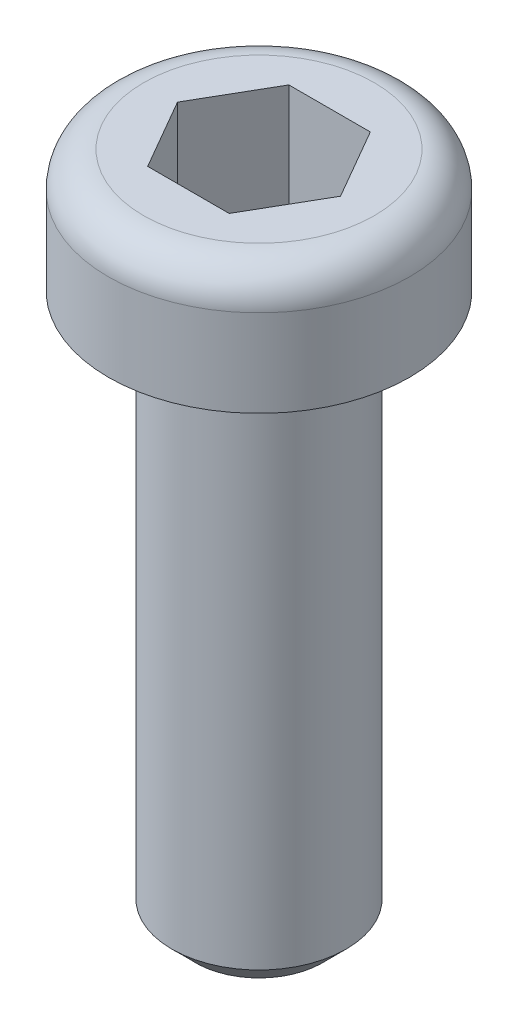
ISO-10303-21;
HEADER;
FILE_DESCRIPTION(('STEP AP214'),'2;1');
FILE_NAME('part.step','',(''),(''),'','','');
FILE_SCHEMA(('AUTOMOTIVE_DESIGN { 1 0 10303 214 1 1 1 1 }'));
ENDSEC;
DATA;
#1=APPLICATION_CONTEXT('core data for automotive mechanical design processes');
#2=APPLICATION_PROTOCOL_DEFINITION('international standard','automotive_design',2000,#1);
#3=PRODUCT_CONTEXT('',#1,'mechanical');
#4=PRODUCT('Part','Part','',(#3));
#5=PRODUCT_RELATED_PRODUCT_CATEGORY('part','',(#4));
#6=PRODUCT_DEFINITION_FORMATION('','',#4);
#7=PRODUCT_DEFINITION_CONTEXT('part definition',#1,'design');
#8=PRODUCT_DEFINITION('design','',#6,#7);
#9=PRODUCT_DEFINITION_SHAPE('','',#8);
#10=(LENGTH_UNIT() NAMED_UNIT(*) SI_UNIT(.MILLI.,.METRE.));
#11=(NAMED_UNIT(*) PLANE_ANGLE_UNIT() SI_UNIT($,.RADIAN.));
#12=(NAMED_UNIT(*) SI_UNIT($,.STERADIAN.) SOLID_ANGLE_UNIT());
#13=UNCERTAINTY_MEASURE_WITH_UNIT(LENGTH_MEASURE(1.E-05),#10,'distance_accuracy_value','');
#14=(GEOMETRIC_REPRESENTATION_CONTEXT(3) GLOBAL_UNCERTAINTY_ASSIGNED_CONTEXT((#13)) GLOBAL_UNIT_ASSIGNED_CONTEXT((#10,
#11,#12)) REPRESENTATION_CONTEXT('',''));
#15=CARTESIAN_POINT('',(0.,0.,0.));
#16=DIRECTION('',(0.,0.,1.));
#17=DIRECTION('',(1.,0.,0.));
#18=AXIS2_PLACEMENT_3D('',#15,#16,#17);
#19=CARTESIAN_POINT('',(0.,2.6,0.));
#20=DIRECTION('',(0.,1.,0.));
#21=DIRECTION('',(0.,0.,1.));
#22=AXIS2_PLACEMENT_3D('',#19,#20,#21);
#23=PLANE('',#22);
#24=CARTESIAN_POINT('',(0.,2.6,0.));
#25=DIRECTION('',(0.,1.,0.));
#26=DIRECTION('',(0.,0.,1.));
#27=AXIS2_PLACEMENT_3D('',#24,#25,#26);
#28=CIRCLE('',#27,2.45);
#29=CARTESIAN_POINT('',(0.,2.6,2.45));
#30=VERTEX_POINT('',#29);
#31=EDGE_CURVE('E144',#30,#30,#28,.T.);
#32=ORIENTED_EDGE('',*,*,#31,.T.);
#33=EDGE_LOOP('',(#32));
#34=FACE_BOUND('',#33,.T.);
#35=DIRECTION('',(-0.5,0.,-0.866025403784438));
#36=VECTOR('',#35,1.);
#37=CARTESIAN_POINT('',(1.73205080756888,2.6,0.));
#38=LINE('',#37,#36);
#39=CARTESIAN_POINT('',(1.73205080756888,2.6,0.));
#40=VERTEX_POINT('',#39);
#41=CARTESIAN_POINT('',(0.866025403784438,2.6,-1.5));
#42=VERTEX_POINT('',#41);
#43=EDGE_CURVE('E102',#40,#42,#38,.T.);
#44=ORIENTED_EDGE('',*,*,#43,.F.);
#45=DIRECTION('',(0.5,0.,-0.866025403784439));
#46=VECTOR('',#45,1.);
#47=CARTESIAN_POINT('',(0.86602540378444,2.6,1.5));
#48=LINE('',#47,#46);
#49=CARTESIAN_POINT('',(0.86602540378444,2.6,1.5));
#50=VERTEX_POINT('',#49);
#51=EDGE_CURVE('E82',#50,#40,#48,.T.);
#52=ORIENTED_EDGE('',*,*,#51,.F.);
#53=DIRECTION('',(1.,0.,0.));
#54=VECTOR('',#53,1.);
#55=CARTESIAN_POINT('',(-0.866025403784438,2.6,1.5));
#56=LINE('',#55,#54);
#57=CARTESIAN_POINT('',(-0.866025403784438,2.6,1.5));
#58=VERTEX_POINT('',#57);
#59=EDGE_CURVE('E53',#58,#50,#56,.T.);
#60=ORIENTED_EDGE('',*,*,#59,.F.);
#61=DIRECTION('',(0.5,0.,0.866025403784438));
#62=VECTOR('',#61,1.);
#63=CARTESIAN_POINT('',(-1.73205080756888,2.6,0.));
#64=LINE('',#63,#62);
#65=CARTESIAN_POINT('',(-1.73205080756888,2.6,0.));
#66=VERTEX_POINT('',#65);
#67=EDGE_CURVE('E113',#66,#58,#64,.T.);
#68=ORIENTED_EDGE('',*,*,#67,.F.);
#69=DIRECTION('',(-0.5,0.,0.866025403784438));
#70=VECTOR('',#69,1.);
#71=CARTESIAN_POINT('',(-0.866025403784438,2.6,-1.5));
#72=LINE('',#71,#70);
#73=CARTESIAN_POINT('',(-0.866025403784438,2.6,-1.5));
#74=VERTEX_POINT('',#73);
#75=EDGE_CURVE('E101',#74,#66,#72,.T.);
#76=ORIENTED_EDGE('',*,*,#75,.F.);
#77=DIRECTION('',(-1.,0.,0.));
#78=VECTOR('',#77,1.);
#79=CARTESIAN_POINT('',(0.866025403784438,2.6,-1.5));
#80=LINE('',#79,#78);
#81=EDGE_CURVE('E91',#42,#74,#80,.T.);
#82=ORIENTED_EDGE('',*,*,#81,.F.);
#83=EDGE_LOOP('',(#44,#52,#60,#68,#76,#82));
#84=FACE_BOUND('',#83,.T.);
#85=ADVANCED_FACE('F32',(#34,#84),#23,.T.);
#86=CARTESIAN_POINT('',(0.,0.,0.));
#87=DIRECTION('',(0.,1.,0.));
#88=DIRECTION('',(0.,0.,1.));
#89=AXIS2_PLACEMENT_3D('',#86,#87,#88);
#90=PLANE('',#89);
#91=CARTESIAN_POINT('',(0.,0.,0.));
#92=DIRECTION('',(0.,1.,0.));
#93=DIRECTION('',(0.,0.,1.));
#94=AXIS2_PLACEMENT_3D('',#91,#92,#93);
#95=CIRCLE('',#94,1.85);
#96=CARTESIAN_POINT('',(0.,0.,1.85));
#97=VERTEX_POINT('',#96);
#98=EDGE_CURVE('E150',#97,#97,#95,.F.);
#99=ORIENTED_EDGE('',*,*,#98,.F.);
#100=EDGE_LOOP('',(#99));
#101=FACE_BOUND('',#100,.T.);
#102=CARTESIAN_POINT('',(0.,0.,0.));
#103=DIRECTION('',(0.,1.,0.));
#104=DIRECTION('',(0.,0.,1.));
#105=AXIS2_PLACEMENT_3D('',#102,#103,#104);
#106=CIRCLE('',#105,3.2);
#107=CARTESIAN_POINT('',(0.,0.,3.2));
#108=VERTEX_POINT('',#107);
#109=EDGE_CURVE('E141',#108,#108,#106,.T.);
#110=ORIENTED_EDGE('',*,*,#109,.F.);
#111=EDGE_LOOP('',(#110));
#112=FACE_BOUND('',#111,.T.);
#113=ADVANCED_FACE('F166',(#101,#112),#90,.F.);
#114=CARTESIAN_POINT('',(0.,2.6,0.));
#115=DIRECTION('',(0.,-1.,0.));
#116=DIRECTION('',(0.,0.,-1.));
#117=AXIS2_PLACEMENT_3D('',#114,#115,#116);
#118=CYLINDRICAL_SURFACE('',#117,3.2);
#119=CARTESIAN_POINT('',(0.,1.85,0.));
#120=DIRECTION('',(0.,1.,0.));
#121=DIRECTION('',(0.,0.,1.));
#122=AXIS2_PLACEMENT_3D('',#119,#120,#121);
#123=CIRCLE('',#122,3.2);
#124=CARTESIAN_POINT('',(0.,1.85,3.2));
#125=VERTEX_POINT('',#124);
#126=EDGE_CURVE('E147',#125,#125,#123,.F.);
#127=ORIENTED_EDGE('',*,*,#126,.T.);
#128=EDGE_LOOP('',(#127));
#129=FACE_BOUND('',#128,.T.);
#130=ORIENTED_EDGE('',*,*,#109,.T.);
#131=EDGE_LOOP('',(#130));
#132=FACE_BOUND('',#131,.T.);
#133=ADVANCED_FACE('F172',(#129,#132),#118,.T.);
#134=CARTESIAN_POINT('',(0.86602540378444,2.6,1.5));
#135=DIRECTION('',(-0.866025403784439,0.,-0.5));
#136=DIRECTION('',(-0.5,0.,0.866025403784439));
#137=AXIS2_PLACEMENT_3D('',#134,#135,#136);
#138=PLANE('',#137);
#139=DIRECTION('',(0.5,0.,-0.866025403784439));
#140=VECTOR('',#139,1.);
#141=CARTESIAN_POINT('',(0.86602540378444,0.,1.5));
#142=LINE('',#141,#140);
#143=CARTESIAN_POINT('',(0.86602540378444,0.,1.5));
#144=VERTEX_POINT('',#143);
#145=CARTESIAN_POINT('',(1.73205080756888,0.,0.));
#146=VERTEX_POINT('',#145);
#147=EDGE_CURVE('E120',#144,#146,#142,.T.);
#148=ORIENTED_EDGE('',*,*,#147,.F.);
#149=DIRECTION('',(0.,-1.,0.));
#150=VECTOR('',#149,1.);
#151=CARTESIAN_POINT('',(0.86602540378444,2.6,1.5));
#152=LINE('',#151,#150);
#153=EDGE_CURVE('E119',#50,#144,#152,.T.);
#154=ORIENTED_EDGE('',*,*,#153,.F.);
#155=ORIENTED_EDGE('',*,*,#51,.T.);
#156=DIRECTION('',(0.,-1.,0.));
#157=VECTOR('',#156,1.);
#158=CARTESIAN_POINT('',(1.73205080756888,2.6,0.));
#159=LINE('',#158,#157);
#160=EDGE_CURVE('E139',#40,#146,#159,.T.);
#161=ORIENTED_EDGE('',*,*,#160,.T.);
#162=EDGE_LOOP('',(#148,#154,#155,#161));
#163=FACE_BOUND('',#162,.T.);
#164=ADVANCED_FACE('F176',(#163),#138,.T.);
#165=CARTESIAN_POINT('',(1.73205080756888,2.6,0.));
#166=DIRECTION('',(-0.866025403784438,0.,0.5));
#167=DIRECTION('',(0.5,0.,0.866025403784438));
#168=AXIS2_PLACEMENT_3D('',#165,#166,#167);
#169=PLANE('',#168);
#170=DIRECTION('',(-0.5,0.,-0.866025403784438));
#171=VECTOR('',#170,1.);
#172=CARTESIAN_POINT('',(1.73205080756888,0.,0.));
#173=LINE('',#172,#171);
#174=CARTESIAN_POINT('',(0.866025403784438,0.,-1.5));
#175=VERTEX_POINT('',#174);
#176=EDGE_CURVE('E123',#146,#175,#173,.T.);
#177=ORIENTED_EDGE('',*,*,#176,.F.);
#178=ORIENTED_EDGE('',*,*,#160,.F.);
#179=ORIENTED_EDGE('',*,*,#43,.T.);
#180=DIRECTION('',(0.,-1.,0.));
#181=VECTOR('',#180,1.);
#182=CARTESIAN_POINT('',(0.866025403784438,2.6,-1.5));
#183=LINE('',#182,#181);
#184=EDGE_CURVE('E97',#42,#175,#183,.T.);
#185=ORIENTED_EDGE('',*,*,#184,.T.);
#186=EDGE_LOOP('',(#177,#178,#179,#185));
#187=FACE_BOUND('',#186,.T.);
#188=ADVANCED_FACE('F209',(#187),#169,.T.);
#189=CARTESIAN_POINT('',(0.866025403784438,2.6,-1.5));
#190=DIRECTION('',(0.,0.,1.));
#191=DIRECTION('',(1.,0.,0.));
#192=AXIS2_PLACEMENT_3D('',#189,#190,#191);
#193=PLANE('',#192);
#194=DIRECTION('',(-1.,0.,0.));
#195=VECTOR('',#194,1.);
#196=CARTESIAN_POINT('',(0.866025403784438,0.,-1.5));
#197=LINE('',#196,#195);
#198=CARTESIAN_POINT('',(-0.866025403784438,0.,-1.5));
#199=VERTEX_POINT('',#198);
#200=EDGE_CURVE('E126',#175,#199,#197,.T.);
#201=ORIENTED_EDGE('',*,*,#200,.F.);
#202=ORIENTED_EDGE('',*,*,#184,.F.);
#203=ORIENTED_EDGE('',*,*,#81,.T.);
#204=DIRECTION('',(0.,-1.,0.));
#205=VECTOR('',#204,1.);
#206=CARTESIAN_POINT('',(-0.866025403784438,2.6,-1.5));
#207=LINE('',#206,#205);
#208=EDGE_CURVE('E95',#74,#199,#207,.T.);
#209=ORIENTED_EDGE('',*,*,#208,.T.);
#210=EDGE_LOOP('',(#201,#202,#203,#209));
#211=FACE_BOUND('',#210,.T.);
#212=ADVANCED_FACE('F94',(#211),#193,.T.);
#213=CARTESIAN_POINT('',(-0.866025403784438,2.6,-1.5));
#214=DIRECTION('',(0.866025403784439,0.,0.5));
#215=DIRECTION('',(0.5,0.,-0.866025403784439));
#216=AXIS2_PLACEMENT_3D('',#213,#214,#215);
#217=PLANE('',#216);
#218=DIRECTION('',(-0.5,0.,0.866025403784438));
#219=VECTOR('',#218,1.);
#220=CARTESIAN_POINT('',(-0.866025403784438,0.,-1.5));
#221=LINE('',#220,#219);
#222=CARTESIAN_POINT('',(-1.73205080756888,0.,0.));
#223=VERTEX_POINT('',#222);
#224=EDGE_CURVE('E108',#199,#223,#221,.T.);
#225=ORIENTED_EDGE('',*,*,#224,.F.);
#226=ORIENTED_EDGE('',*,*,#208,.F.);
#227=ORIENTED_EDGE('',*,*,#75,.T.);
#228=DIRECTION('',(0.,-1.,0.));
#229=VECTOR('',#228,1.);
#230=CARTESIAN_POINT('',(-1.73205080756888,2.6,0.));
#231=LINE('',#230,#229);
#232=EDGE_CURVE('E110',#66,#223,#231,.T.);
#233=ORIENTED_EDGE('',*,*,#232,.T.);
#234=EDGE_LOOP('',(#225,#226,#227,#233));
#235=FACE_BOUND('',#234,.T.);
#236=ADVANCED_FACE('F105',(#235),#217,.T.);
#237=CARTESIAN_POINT('',(-1.73205080756888,2.6,0.));
#238=DIRECTION('',(0.866025403784438,0.,-0.5));
#239=DIRECTION('',(-0.5,0.,-0.866025403784438));
#240=AXIS2_PLACEMENT_3D('',#237,#238,#239);
#241=PLANE('',#240);
#242=DIRECTION('',(0.5,0.,0.866025403784438));
#243=VECTOR('',#242,1.);
#244=CARTESIAN_POINT('',(-1.73205080756888,0.,0.));
#245=LINE('',#244,#243);
#246=CARTESIAN_POINT('',(-0.866025403784438,0.,1.5));
#247=VERTEX_POINT('',#246);
#248=EDGE_CURVE('E129',#223,#247,#245,.T.);
#249=ORIENTED_EDGE('',*,*,#248,.F.);
#250=ORIENTED_EDGE('',*,*,#232,.F.);
#251=ORIENTED_EDGE('',*,*,#67,.T.);
#252=DIRECTION('',(0.,-1.,0.));
#253=VECTOR('',#252,1.);
#254=CARTESIAN_POINT('',(-0.866025403784438,2.6,1.5));
#255=LINE('',#254,#253);
#256=EDGE_CURVE('E47',#58,#247,#255,.T.);
#257=ORIENTED_EDGE('',*,*,#256,.T.);
#258=EDGE_LOOP('',(#249,#250,#251,#257));
#259=FACE_BOUND('',#258,.T.);
#260=ADVANCED_FACE('F192',(#259),#241,.T.);
#261=CARTESIAN_POINT('',(-0.866025403784438,2.6,1.5));
#262=DIRECTION('',(0.,0.,-1.));
#263=DIRECTION('',(-1.,0.,0.));
#264=AXIS2_PLACEMENT_3D('',#261,#262,#263);
#265=PLANE('',#264);
#266=DIRECTION('',(1.,0.,0.));
#267=VECTOR('',#266,1.);
#268=CARTESIAN_POINT('',(-0.866025403784438,0.,1.5));
#269=LINE('',#268,#267);
#270=EDGE_CURVE('E132',#247,#144,#269,.T.);
#271=ORIENTED_EDGE('',*,*,#270,.F.);
#272=ORIENTED_EDGE('',*,*,#256,.F.);
#273=ORIENTED_EDGE('',*,*,#59,.T.);
#274=ORIENTED_EDGE('',*,*,#153,.T.);
#275=EDGE_LOOP('',(#271,#272,#273,#274));
#276=FACE_BOUND('',#275,.T.);
#277=ADVANCED_FACE('F184',(#276),#265,.T.);
#278=CARTESIAN_POINT('',(0.,1.85,0.));
#279=DIRECTION('',(0.,1.,0.));
#280=DIRECTION('',(0.,0.,1.));
#281=AXIS2_PLACEMENT_3D('',#278,#279,#280);
#282=TOROIDAL_SURFACE('',#281,2.45,0.75);
#283=ORIENTED_EDGE('',*,*,#126,.F.);
#284=EDGE_LOOP('',(#283));
#285=FACE_BOUND('',#284,.T.);
#286=ORIENTED_EDGE('',*,*,#31,.F.);
#287=EDGE_LOOP('',(#286));
#288=FACE_BOUND('',#287,.T.);
#289=ADVANCED_FACE('F181',(#285,#288),#282,.T.);
#290=CARTESIAN_POINT('',(0.,0.,0.));
#291=DIRECTION('',(0.,-1.,0.));
#292=DIRECTION('',(0.,0.,-1.));
#293=AXIS2_PLACEMENT_3D('',#290,#291,#292);
#294=PLANE('',#293);
#295=ORIENTED_EDGE('',*,*,#147,.T.);
#296=ORIENTED_EDGE('',*,*,#176,.T.);
#297=ORIENTED_EDGE('',*,*,#200,.T.);
#298=ORIENTED_EDGE('',*,*,#224,.T.);
#299=ORIENTED_EDGE('',*,*,#248,.T.);
#300=ORIENTED_EDGE('',*,*,#270,.T.);
#301=EDGE_LOOP('',(#295,#296,#297,#298,#299,#300));
#302=FACE_BOUND('',#301,.T.);
#303=ADVANCED_FACE('F183',(#302),#294,.F.);
#304=CARTESIAN_POINT('',(0.,-11.7,0.));
#305=DIRECTION('',(0.,1.,0.));
#306=DIRECTION('',(0.,0.,1.));
#307=AXIS2_PLACEMENT_3D('',#304,#305,#306);
#308=CYLINDRICAL_SURFACE('',#307,1.85);
#309=CARTESIAN_POINT('',(0.,-11.2,0.));
#310=DIRECTION('',(0.,-1.,0.));
#311=DIRECTION('',(0.,0.,-1.));
#312=AXIS2_PLACEMENT_3D('',#309,#310,#311);
#313=CIRCLE('',#312,1.85);
#314=CARTESIAN_POINT('',(0.,-11.2,-1.85));
#315=VERTEX_POINT('',#314);
#316=EDGE_CURVE('E11',#315,#315,#313,.F.);
#317=ORIENTED_EDGE('',*,*,#316,.T.);
#318=EDGE_LOOP('',(#317));
#319=FACE_BOUND('',#318,.T.);
#320=ORIENTED_EDGE('',*,*,#98,.T.);
#321=EDGE_LOOP('',(#320));
#322=FACE_BOUND('',#321,.T.);
#323=ADVANCED_FACE('F162',(#319,#322),#308,.T.);
#324=CARTESIAN_POINT('',(0.,-11.7,0.));
#325=DIRECTION('',(0.,-1.,0.));
#326=DIRECTION('',(0.,0.,-1.));
#327=AXIS2_PLACEMENT_3D('',#324,#325,#326);
#328=PLANE('',#327);
#329=CARTESIAN_POINT('',(0.,-11.7,0.));
#330=DIRECTION('',(0.,-1.,0.));
#331=DIRECTION('',(0.,0.,-1.));
#332=AXIS2_PLACEMENT_3D('',#329,#330,#331);
#333=CIRCLE('',#332,1.35);
#334=CARTESIAN_POINT('',(0.,-11.7,-1.35));
#335=VERTEX_POINT('',#334);
#336=EDGE_CURVE('E40',#335,#335,#333,.T.);
#337=ORIENTED_EDGE('',*,*,#336,.T.);
#338=EDGE_LOOP('',(#337));
#339=FACE_BOUND('',#338,.T.);
#340=ADVANCED_FACE('F155',(#339),#328,.T.);
#341=CARTESIAN_POINT('',(0.,-11.7,0.));
#342=DIRECTION('',(0.,1.,0.));
#343=DIRECTION('',(0.,0.,1.));
#344=AXIS2_PLACEMENT_3D('',#341,#342,#343);
#345=CONICAL_SURFACE('',#344,1.35,0.785398163397449);
#346=ORIENTED_EDGE('',*,*,#316,.F.);
#347=EDGE_LOOP('',(#346));
#348=FACE_BOUND('',#347,.T.);
#349=ORIENTED_EDGE('',*,*,#336,.F.);
#350=EDGE_LOOP('',(#349));
#351=FACE_BOUND('',#350,.T.);
#352=ADVANCED_FACE('F34',(#348,#351),#345,.T.);
#353=CLOSED_SHELL('',(#85,#113,#133,#164,#188,#212,#236,#260,#277,#289,#303,#323,#340,#352));
#354=MANIFOLD_SOLID_BREP('B2',#353);
#355=ADVANCED_BREP_SHAPE_REPRESENTATION('',(#18,#354),#14);
#356=SHAPE_DEFINITION_REPRESENTATION(#9,#355);
ENDSEC;
END-ISO-10303-21;
